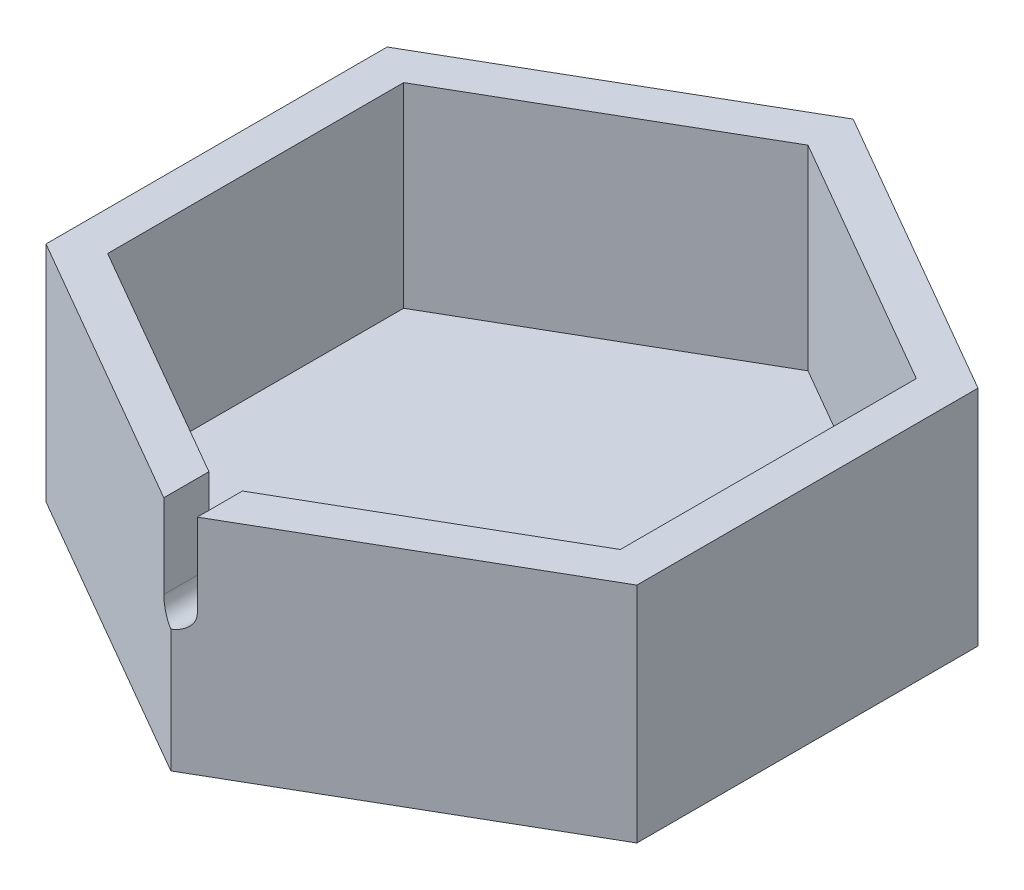
ISO-10303-21;
HEADER;
FILE_DESCRIPTION(('STEP AP214'),'2;1');
FILE_NAME('part.step','',(''),(''),'','','');
FILE_SCHEMA(('AUTOMOTIVE_DESIGN { 1 0 10303 214 1 1 1 1 }'));
ENDSEC;
DATA;
#1=APPLICATION_CONTEXT('core data for automotive mechanical design processes');
#2=APPLICATION_PROTOCOL_DEFINITION('international standard','automotive_design',2000,#1);
#3=PRODUCT_CONTEXT('',#1,'mechanical');
#4=PRODUCT('Part','Part','',(#3));
#5=PRODUCT_RELATED_PRODUCT_CATEGORY('part','',(#4));
#6=PRODUCT_DEFINITION_FORMATION('','',#4);
#7=PRODUCT_DEFINITION_CONTEXT('part definition',#1,'design');
#8=PRODUCT_DEFINITION('design','',#6,#7);
#9=PRODUCT_DEFINITION_SHAPE('','',#8);
#10=(LENGTH_UNIT() NAMED_UNIT(*) SI_UNIT(.MILLI.,.METRE.));
#11=(NAMED_UNIT(*) PLANE_ANGLE_UNIT() SI_UNIT($,.RADIAN.));
#12=(NAMED_UNIT(*) SI_UNIT($,.STERADIAN.) SOLID_ANGLE_UNIT());
#13=UNCERTAINTY_MEASURE_WITH_UNIT(LENGTH_MEASURE(1.E-05),#10,'distance_accuracy_value','');
#14=(GEOMETRIC_REPRESENTATION_CONTEXT(3) GLOBAL_UNCERTAINTY_ASSIGNED_CONTEXT((#13)) GLOBAL_UNIT_ASSIGNED_CONTEXT((#10,
#11,#12)) REPRESENTATION_CONTEXT('',''));
#15=CARTESIAN_POINT('',(0.,0.,0.));
#16=DIRECTION('',(0.,0.,1.));
#17=DIRECTION('',(1.,0.,0.));
#18=AXIS2_PLACEMENT_3D('',#15,#16,#17);
#19=CARTESIAN_POINT('',(0.,40.,53.0066462313452));
#20=DIRECTION('',(-0.5,0.,-0.866025403784439));
#21=DIRECTION('',(-0.866025403784439,0.,0.5));
#22=AXIS2_PLACEMENT_3D('',#19,#20,#21);
#23=PLANE('',#22);
#24=DIRECTION('',(0.,-1.,0.));
#25=VECTOR('',#24,1.);
#26=CARTESIAN_POINT('',(3.00000000000005,40.,51.2745954237763));
#27=LINE('',#26,#25);
#28=CARTESIAN_POINT('',(3.00000000000005,40.,51.2745954237763));
#29=VERTEX_POINT('',#28);
#30=CARTESIAN_POINT('',(3.00000000000005,25.,51.2745954237763));
#31=VERTEX_POINT('',#30);
#32=EDGE_CURVE('E159',#29,#31,#27,.T.);
#33=ORIENTED_EDGE('',*,*,#32,.F.);
#34=DIRECTION('',(0.866025403784439,0.,-0.5));
#35=VECTOR('',#34,1.);
#36=CARTESIAN_POINT('',(0.,40.,53.0066462313452));
#37=LINE('',#36,#35);
#38=CARTESIAN_POINT('',(45.9051022057597,40.,26.5033231156726));
#39=VERTEX_POINT('',#38);
#40=EDGE_CURVE('E171',#29,#39,#37,.T.);
#41=ORIENTED_EDGE('',*,*,#40,.T.);
#42=DIRECTION('',(0.,-1.,0.));
#43=VECTOR('',#42,1.);
#44=CARTESIAN_POINT('',(45.9051022057597,40.,26.5033231156726));
#45=LINE('',#44,#43);
#46=CARTESIAN_POINT('',(45.9051022057597,5.,26.5033231156726));
#47=VERTEX_POINT('',#46);
#48=EDGE_CURVE('E225',#39,#47,#45,.T.);
#49=ORIENTED_EDGE('',*,*,#48,.T.);
#50=DIRECTION('',(-0.866025403784439,0.,0.5));
#51=VECTOR('',#50,1.);
#52=CARTESIAN_POINT('',(0.,5.,53.0066462313452));
#53=LINE('',#52,#51);
#54=CARTESIAN_POINT('',(0.,5.,53.0066462313452));
#55=VERTEX_POINT('',#54);
#56=EDGE_CURVE('E182',#47,#55,#53,.T.);
#57=ORIENTED_EDGE('',*,*,#56,.T.);
#58=DIRECTION('',(0.,-1.,0.));
#59=VECTOR('',#58,1.);
#60=CARTESIAN_POINT('',(0.,40.,53.0066462313452));
#61=LINE('',#60,#59);
#62=CARTESIAN_POINT('',(0.,22.,53.0066462313452));
#63=VERTEX_POINT('',#62);
#64=EDGE_CURVE('E206',#63,#55,#61,.T.);
#65=ORIENTED_EDGE('',*,*,#64,.F.);
#66=CARTESIAN_POINT('',(0.,25.,53.0066462313452));
#67=DIRECTION('',(-0.5,0.,-0.866025403784439));
#68=DIRECTION('',(-0.866025403784439,0.,0.5));
#69=AXIS2_PLACEMENT_3D('',#66,#67,#68);
#70=ELLIPSE('',#69,3.46410161513775,3.);
#71=EDGE_CURVE('E174',#31,#63,#70,.T.);
#72=ORIENTED_EDGE('',*,*,#71,.F.);
#73=EDGE_LOOP('',(#33,#41,#49,#57,#65,#72));
#74=FACE_BOUND('',#73,.T.);
#75=ADVANCED_FACE('F41',(#74),#23,.T.);
#76=CARTESIAN_POINT('',(45.9051022057597,40.,26.5033231156726));
#77=DIRECTION('',(-1.,0.,0.));
#78=DIRECTION('',(0.,0.,1.));
#79=AXIS2_PLACEMENT_3D('',#76,#77,#78);
#80=PLANE('',#79);
#81=DIRECTION('',(0.,-1.,0.));
#82=VECTOR('',#81,1.);
#83=CARTESIAN_POINT('',(45.9051022057596,40.,-26.5033231156726));
#84=LINE('',#83,#82);
#85=CARTESIAN_POINT('',(45.9051022057596,40.,-26.5033231156726));
#86=VERTEX_POINT('',#85);
#87=CARTESIAN_POINT('',(45.9051022057596,5.,-26.5033231156726));
#88=VERTEX_POINT('',#87);
#89=EDGE_CURVE('E221',#86,#88,#84,.T.);
#90=ORIENTED_EDGE('',*,*,#89,.T.);
#91=DIRECTION('',(0.,0.,1.));
#92=VECTOR('',#91,1.);
#93=CARTESIAN_POINT('',(45.9051022057597,5.,26.5033231156726));
#94=LINE('',#93,#92);
#95=EDGE_CURVE('E189',#88,#47,#94,.T.);
#96=ORIENTED_EDGE('',*,*,#95,.T.);
#97=ORIENTED_EDGE('',*,*,#48,.F.);
#98=DIRECTION('',(0.,0.,-1.));
#99=VECTOR('',#98,1.);
#100=CARTESIAN_POINT('',(45.9051022057597,40.,26.5033231156726));
#101=LINE('',#100,#99);
#102=EDGE_CURVE('E180',#39,#86,#101,.T.);
#103=ORIENTED_EDGE('',*,*,#102,.T.);
#104=EDGE_LOOP('',(#90,#96,#97,#103));
#105=FACE_BOUND('',#104,.T.);
#106=ADVANCED_FACE('F332',(#105),#80,.T.);
#107=CARTESIAN_POINT('',(45.9051022057596,40.,-26.5033231156726));
#108=DIRECTION('',(-0.5,0.,0.866025403784439));
#109=DIRECTION('',(0.866025403784439,0.,0.5));
#110=AXIS2_PLACEMENT_3D('',#107,#108,#109);
#111=PLANE('',#110);
#112=DIRECTION('',(0.,-1.,0.));
#113=VECTOR('',#112,1.);
#114=CARTESIAN_POINT('',(0.,40.,-53.0066462313452));
#115=LINE('',#114,#113);
#116=CARTESIAN_POINT('',(0.,40.,-53.0066462313452));
#117=VERTEX_POINT('',#116);
#118=CARTESIAN_POINT('',(0.,5.,-53.0066462313452));
#119=VERTEX_POINT('',#118);
#120=EDGE_CURVE('E217',#117,#119,#115,.T.);
#121=ORIENTED_EDGE('',*,*,#120,.T.);
#122=DIRECTION('',(0.866025403784439,0.,0.5));
#123=VECTOR('',#122,1.);
#124=CARTESIAN_POINT('',(45.9051022057596,5.,-26.5033231156726));
#125=LINE('',#124,#123);
#126=EDGE_CURVE('E326',#119,#88,#125,.T.);
#127=ORIENTED_EDGE('',*,*,#126,.T.);
#128=ORIENTED_EDGE('',*,*,#89,.F.);
#129=DIRECTION('',(-0.866025403784439,0.,-0.5));
#130=VECTOR('',#129,1.);
#131=CARTESIAN_POINT('',(45.9051022057596,40.,-26.5033231156726));
#132=LINE('',#131,#130);
#133=EDGE_CURVE('E186',#86,#117,#132,.T.);
#134=ORIENTED_EDGE('',*,*,#133,.T.);
#135=EDGE_LOOP('',(#121,#127,#128,#134));
#136=FACE_BOUND('',#135,.T.);
#137=ADVANCED_FACE('F363',(#136),#111,.T.);
#138=CARTESIAN_POINT('',(0.,40.,-53.0066462313452));
#139=DIRECTION('',(0.5,0.,0.866025403784439));
#140=DIRECTION('',(0.866025403784439,0.,-0.5));
#141=AXIS2_PLACEMENT_3D('',#138,#139,#140);
#142=PLANE('',#141);
#143=DIRECTION('',(0.,-1.,0.));
#144=VECTOR('',#143,1.);
#145=CARTESIAN_POINT('',(-45.9051022057596,40.,-26.5033231156726));
#146=LINE('',#145,#144);
#147=CARTESIAN_POINT('',(-45.9051022057596,40.,-26.5033231156726));
#148=VERTEX_POINT('',#147);
#149=CARTESIAN_POINT('',(-45.9051022057596,5.,-26.5033231156726));
#150=VERTEX_POINT('',#149);
#151=EDGE_CURVE('E213',#148,#150,#146,.T.);
#152=ORIENTED_EDGE('',*,*,#151,.T.);
#153=DIRECTION('',(0.866025403784439,0.,-0.5));
#154=VECTOR('',#153,1.);
#155=CARTESIAN_POINT('',(0.,5.,-53.0066462313452));
#156=LINE('',#155,#154);
#157=EDGE_CURVE('E322',#150,#119,#156,.T.);
#158=ORIENTED_EDGE('',*,*,#157,.T.);
#159=ORIENTED_EDGE('',*,*,#120,.F.);
#160=DIRECTION('',(-0.866025403784439,0.,0.5));
#161=VECTOR('',#160,1.);
#162=CARTESIAN_POINT('',(0.,40.,-53.0066462313452));
#163=LINE('',#162,#161);
#164=EDGE_CURVE('E195',#117,#148,#163,.T.);
#165=ORIENTED_EDGE('',*,*,#164,.T.);
#166=EDGE_LOOP('',(#152,#158,#159,#165));
#167=FACE_BOUND('',#166,.T.);
#168=ADVANCED_FACE('F430',(#167),#142,.T.);
#169=CARTESIAN_POINT('',(-45.9051022057596,40.,-26.5033231156726));
#170=DIRECTION('',(1.,0.,0.));
#171=DIRECTION('',(0.,0.,-1.));
#172=AXIS2_PLACEMENT_3D('',#169,#170,#171);
#173=PLANE('',#172);
#174=DIRECTION('',(0.,-1.,0.));
#175=VECTOR('',#174,1.);
#176=CARTESIAN_POINT('',(-45.9051022057596,40.,26.5033231156726));
#177=LINE('',#176,#175);
#178=CARTESIAN_POINT('',(-45.9051022057596,40.,26.5033231156726));
#179=VERTEX_POINT('',#178);
#180=CARTESIAN_POINT('',(-45.9051022057596,5.,26.5033231156726));
#181=VERTEX_POINT('',#180);
#182=EDGE_CURVE('E209',#179,#181,#177,.T.);
#183=ORIENTED_EDGE('',*,*,#182,.T.);
#184=DIRECTION('',(0.,0.,-1.));
#185=VECTOR('',#184,1.);
#186=CARTESIAN_POINT('',(-45.9051022057596,5.,-26.5033231156726));
#187=LINE('',#186,#185);
#188=EDGE_CURVE('E65',#181,#150,#187,.T.);
#189=ORIENTED_EDGE('',*,*,#188,.T.);
#190=ORIENTED_EDGE('',*,*,#151,.F.);
#191=DIRECTION('',(0.,0.,1.));
#192=VECTOR('',#191,1.);
#193=CARTESIAN_POINT('',(-45.9051022057596,40.,-26.5033231156726));
#194=LINE('',#193,#192);
#195=EDGE_CURVE('E198',#148,#179,#194,.T.);
#196=ORIENTED_EDGE('',*,*,#195,.T.);
#197=EDGE_LOOP('',(#183,#189,#190,#196));
#198=FACE_BOUND('',#197,.T.);
#199=ADVANCED_FACE('F339',(#198),#173,.T.);
#200=CARTESIAN_POINT('',(-45.9051022057596,40.,26.5033231156726));
#201=DIRECTION('',(0.5,0.,-0.866025403784439));
#202=DIRECTION('',(-0.866025403784439,0.,-0.5));
#203=AXIS2_PLACEMENT_3D('',#200,#201,#202);
#204=PLANE('',#203);
#205=CARTESIAN_POINT('',(0.,25.,53.0066462313453));
#206=DIRECTION('',(0.5,0.,-0.866025403784439));
#207=DIRECTION('',(0.866025403784439,0.,0.5));
#208=AXIS2_PLACEMENT_3D('',#205,#206,#207);
#209=ELLIPSE('',#208,3.46410161513775,3.);
#210=CARTESIAN_POINT('',(-2.99999999999995,25.,51.2745954237764));
#211=VERTEX_POINT('',#210);
#212=EDGE_CURVE('E310',#63,#211,#209,.T.);
#213=ORIENTED_EDGE('',*,*,#212,.F.);
#214=ORIENTED_EDGE('',*,*,#64,.T.);
#215=DIRECTION('',(-0.866025403784439,0.,-0.5));
#216=VECTOR('',#215,1.);
#217=CARTESIAN_POINT('',(-45.9051022057596,5.,26.5033231156726));
#218=LINE('',#217,#216);
#219=EDGE_CURVE('E290',#55,#181,#218,.T.);
#220=ORIENTED_EDGE('',*,*,#219,.T.);
#221=ORIENTED_EDGE('',*,*,#182,.F.);
#222=DIRECTION('',(0.866025403784439,0.,0.5));
#223=VECTOR('',#222,1.);
#224=CARTESIAN_POINT('',(-45.9051022057596,40.,26.5033231156726));
#225=LINE('',#224,#223);
#226=CARTESIAN_POINT('',(-2.99999999999995,40.,51.2745954237764));
#227=VERTEX_POINT('',#226);
#228=EDGE_CURVE('E202',#179,#227,#225,.T.);
#229=ORIENTED_EDGE('',*,*,#228,.T.);
#230=DIRECTION('',(0.,1.,0.));
#231=VECTOR('',#230,1.);
#232=CARTESIAN_POINT('',(-2.99999999999995,40.,51.2745954237764));
#233=LINE('',#232,#231);
#234=EDGE_CURVE('E165',#211,#227,#233,.T.);
#235=ORIENTED_EDGE('',*,*,#234,.F.);
#236=EDGE_LOOP('',(#213,#214,#220,#221,#229,#235));
#237=FACE_BOUND('',#236,.T.);
#238=ADVANCED_FACE('F337',(#237),#204,.T.);
#239=CARTESIAN_POINT('',(0.,40.,0.));
#240=DIRECTION('',(0.,1.,0.));
#241=DIRECTION('',(0.,0.,1.));
#242=AXIS2_PLACEMENT_3D('',#239,#240,#241);
#243=PLANE('',#242);
#244=DIRECTION('',(0.,0.,1.));
#245=VECTOR('',#244,1.);
#246=CARTESIAN_POINT('',(3.00000000000005,40.,41.5));
#247=LINE('',#246,#245);
#248=CARTESIAN_POINT('',(3.00000000000005,40.,59.3574991924311));
#249=VERTEX_POINT('',#248);
#250=EDGE_CURVE('E155',#29,#249,#247,.T.);
#251=ORIENTED_EDGE('',*,*,#250,.T.);
#252=DIRECTION('',(0.866025403784438,0.,-0.5));
#253=VECTOR('',#252,1.);
#254=CARTESIAN_POINT('',(0.,40.,61.08955));
#255=LINE('',#254,#253);
#256=CARTESIAN_POINT('',(52.9051022057597,40.,30.544775));
#257=VERTEX_POINT('',#256);
#258=EDGE_CURVE('E229',#249,#257,#255,.T.);
#259=ORIENTED_EDGE('',*,*,#258,.T.);
#260=DIRECTION('',(0.,0.,-1.));
#261=VECTOR('',#260,1.);
#262=CARTESIAN_POINT('',(52.9051022057597,40.,30.544775));
#263=LINE('',#262,#261);
#264=CARTESIAN_POINT('',(52.9051022057597,40.,-30.544775));
#265=VERTEX_POINT('',#264);
#266=EDGE_CURVE('E232',#257,#265,#263,.T.);
#267=ORIENTED_EDGE('',*,*,#266,.T.);
#268=DIRECTION('',(-0.866025403784439,0.,-0.5));
#269=VECTOR('',#268,1.);
#270=CARTESIAN_POINT('',(52.9051022057597,40.,-30.544775));
#271=LINE('',#270,#269);
#272=CARTESIAN_POINT('',(0.,40.,-61.08955));
#273=VERTEX_POINT('',#272);
#274=EDGE_CURVE('E236',#265,#273,#271,.T.);
#275=ORIENTED_EDGE('',*,*,#274,.T.);
#276=DIRECTION('',(-0.866025403784438,0.,0.5));
#277=VECTOR('',#276,1.);
#278=CARTESIAN_POINT('',(0.,40.,-61.08955));
#279=LINE('',#278,#277);
#280=CARTESIAN_POINT('',(-52.9051022057596,40.,-30.544775));
#281=VERTEX_POINT('',#280);
#282=EDGE_CURVE('E239',#273,#281,#279,.T.);
#283=ORIENTED_EDGE('',*,*,#282,.T.);
#284=DIRECTION('',(0.,0.,1.));
#285=VECTOR('',#284,1.);
#286=CARTESIAN_POINT('',(-52.9051022057596,40.,-30.544775));
#287=LINE('',#286,#285);
#288=CARTESIAN_POINT('',(-52.9051022057596,40.,30.544775));
#289=VERTEX_POINT('',#288);
#290=EDGE_CURVE('E242',#281,#289,#287,.T.);
#291=ORIENTED_EDGE('',*,*,#290,.T.);
#292=DIRECTION('',(0.866025403784439,0.,0.5));
#293=VECTOR('',#292,1.);
#294=CARTESIAN_POINT('',(-52.9051022057596,40.,30.544775));
#295=LINE('',#294,#293);
#296=CARTESIAN_POINT('',(-2.99999999999995,40.,59.3574991924311));
#297=VERTEX_POINT('',#296);
#298=EDGE_CURVE('E245',#289,#297,#295,.T.);
#299=ORIENTED_EDGE('',*,*,#298,.T.);
#300=DIRECTION('',(0.,0.,1.));
#301=VECTOR('',#300,1.);
#302=CARTESIAN_POINT('',(-2.99999999999995,40.,41.5));
#303=LINE('',#302,#301);
#304=EDGE_CURVE('E57',#227,#297,#303,.T.);
#305=ORIENTED_EDGE('',*,*,#304,.F.);
#306=ORIENTED_EDGE('',*,*,#228,.F.);
#307=ORIENTED_EDGE('',*,*,#195,.F.);
#308=ORIENTED_EDGE('',*,*,#164,.F.);
#309=ORIENTED_EDGE('',*,*,#133,.F.);
#310=ORIENTED_EDGE('',*,*,#102,.F.);
#311=ORIENTED_EDGE('',*,*,#40,.F.);
#312=EDGE_LOOP('',(#251,#259,#267,#275,#283,#291,#299,#305,#306,#307,#308,#309,#310,#311));
#313=FACE_BOUND('',#312,.T.);
#314=ADVANCED_FACE('F178',(#313),#243,.T.);
#315=CARTESIAN_POINT('',(0.,0.,0.));
#316=DIRECTION('',(0.,1.,0.));
#317=DIRECTION('',(0.,0.,1.));
#318=AXIS2_PLACEMENT_3D('',#315,#316,#317);
#319=PLANE('',#318);
#320=DIRECTION('',(0.866025403784438,0.,-0.5));
#321=VECTOR('',#320,1.);
#322=CARTESIAN_POINT('',(0.,0.,61.08955));
#323=LINE('',#322,#321);
#324=CARTESIAN_POINT('',(0.,0.,61.08955));
#325=VERTEX_POINT('',#324);
#326=CARTESIAN_POINT('',(52.9051022057597,0.,30.544775));
#327=VERTEX_POINT('',#326);
#328=EDGE_CURVE('E228',#325,#327,#323,.T.);
#329=ORIENTED_EDGE('',*,*,#328,.F.);
#330=DIRECTION('',(0.866025403784439,0.,0.5));
#331=VECTOR('',#330,1.);
#332=CARTESIAN_POINT('',(-52.9051022057596,0.,30.544775));
#333=LINE('',#332,#331);
#334=CARTESIAN_POINT('',(-52.9051022057596,0.,30.544775));
#335=VERTEX_POINT('',#334);
#336=EDGE_CURVE('E233',#335,#325,#333,.T.);
#337=ORIENTED_EDGE('',*,*,#336,.F.);
#338=DIRECTION('',(0.,0.,1.));
#339=VECTOR('',#338,1.);
#340=CARTESIAN_POINT('',(-52.9051022057596,0.,-30.544775));
#341=LINE('',#340,#339);
#342=CARTESIAN_POINT('',(-52.9051022057596,0.,-30.544775));
#343=VERTEX_POINT('',#342);
#344=EDGE_CURVE('E262',#343,#335,#341,.T.);
#345=ORIENTED_EDGE('',*,*,#344,.F.);
#346=DIRECTION('',(-0.866025403784438,0.,0.5));
#347=VECTOR('',#346,1.);
#348=CARTESIAN_POINT('',(0.,0.,-61.08955));
#349=LINE('',#348,#347);
#350=CARTESIAN_POINT('',(0.,0.,-61.08955));
#351=VERTEX_POINT('',#350);
#352=EDGE_CURVE('E259',#351,#343,#349,.T.);
#353=ORIENTED_EDGE('',*,*,#352,.F.);
#354=DIRECTION('',(-0.866025403784439,0.,-0.5));
#355=VECTOR('',#354,1.);
#356=CARTESIAN_POINT('',(52.9051022057597,0.,-30.544775));
#357=LINE('',#356,#355);
#358=CARTESIAN_POINT('',(52.9051022057597,0.,-30.544775));
#359=VERTEX_POINT('',#358);
#360=EDGE_CURVE('E256',#359,#351,#357,.T.);
#361=ORIENTED_EDGE('',*,*,#360,.F.);
#362=DIRECTION('',(0.,0.,-1.));
#363=VECTOR('',#362,1.);
#364=CARTESIAN_POINT('',(52.9051022057597,0.,30.544775));
#365=LINE('',#364,#363);
#366=EDGE_CURVE('E253',#327,#359,#365,.T.);
#367=ORIENTED_EDGE('',*,*,#366,.F.);
#368=EDGE_LOOP('',(#329,#337,#345,#353,#361,#367));
#369=FACE_BOUND('',#368,.T.);
#370=ADVANCED_FACE('F369',(#369),#319,.F.);
#371=CARTESIAN_POINT('',(0.,40.,61.08955));
#372=DIRECTION('',(-0.5,0.,-0.866025403784438));
#373=DIRECTION('',(-0.866025403784439,0.,0.5));
#374=AXIS2_PLACEMENT_3D('',#371,#372,#373);
#375=PLANE('',#374);
#376=ORIENTED_EDGE('',*,*,#258,.F.);
#377=DIRECTION('',(0.,-1.,0.));
#378=VECTOR('',#377,1.);
#379=CARTESIAN_POINT('',(3.00000000000005,40.,59.3574991924311));
#380=LINE('',#379,#378);
#381=CARTESIAN_POINT('',(3.00000000000005,25.,59.3574991924311));
#382=VERTEX_POINT('',#381);
#383=EDGE_CURVE('E11',#249,#382,#380,.T.);
#384=ORIENTED_EDGE('',*,*,#383,.T.);
#385=CARTESIAN_POINT('',(0.,25.,61.08955));
#386=DIRECTION('',(-0.5,0.,-0.866025403784438));
#387=DIRECTION('',(-0.866025403784439,0.,0.5));
#388=AXIS2_PLACEMENT_3D('',#385,#386,#387);
#389=ELLIPSE('',#388,3.46410161513776,3.);
#390=CARTESIAN_POINT('',(0.,22.,61.08955));
#391=VERTEX_POINT('',#390);
#392=EDGE_CURVE('E305',#382,#391,#389,.T.);
#393=ORIENTED_EDGE('',*,*,#392,.T.);
#394=DIRECTION('',(0.,-1.,0.));
#395=VECTOR('',#394,1.);
#396=CARTESIAN_POINT('',(0.,40.,61.08955));
#397=LINE('',#396,#395);
#398=EDGE_CURVE('E249',#391,#325,#397,.T.);
#399=ORIENTED_EDGE('',*,*,#398,.T.);
#400=ORIENTED_EDGE('',*,*,#328,.T.);
#401=DIRECTION('',(0.,-1.,0.));
#402=VECTOR('',#401,1.);
#403=CARTESIAN_POINT('',(52.9051022057597,40.,30.544775));
#404=LINE('',#403,#402);
#405=EDGE_CURVE('E286',#257,#327,#404,.T.);
#406=ORIENTED_EDGE('',*,*,#405,.F.);
#407=EDGE_LOOP('',(#376,#384,#393,#399,#400,#406));
#408=FACE_BOUND('',#407,.T.);
#409=ADVANCED_FACE('F43',(#408),#375,.F.);
#410=CARTESIAN_POINT('',(52.9051022057597,40.,30.544775));
#411=DIRECTION('',(-1.,0.,0.));
#412=DIRECTION('',(0.,0.,1.));
#413=AXIS2_PLACEMENT_3D('',#410,#411,#412);
#414=PLANE('',#413);
#415=ORIENTED_EDGE('',*,*,#366,.T.);
#416=DIRECTION('',(0.,-1.,0.));
#417=VECTOR('',#416,1.);
#418=CARTESIAN_POINT('',(52.9051022057597,40.,-30.544775));
#419=LINE('',#418,#417);
#420=EDGE_CURVE('E282',#265,#359,#419,.T.);
#421=ORIENTED_EDGE('',*,*,#420,.F.);
#422=ORIENTED_EDGE('',*,*,#266,.F.);
#423=ORIENTED_EDGE('',*,*,#405,.T.);
#424=EDGE_LOOP('',(#415,#421,#422,#423));
#425=FACE_BOUND('',#424,.T.);
#426=ADVANCED_FACE('F385',(#425),#414,.F.);
#427=CARTESIAN_POINT('',(52.9051022057597,40.,-30.544775));
#428=DIRECTION('',(-0.5,0.,0.866025403784439));
#429=DIRECTION('',(0.866025403784439,0.,0.5));
#430=AXIS2_PLACEMENT_3D('',#427,#428,#429);
#431=PLANE('',#430);
#432=ORIENTED_EDGE('',*,*,#360,.T.);
#433=DIRECTION('',(0.,-1.,0.));
#434=VECTOR('',#433,1.);
#435=CARTESIAN_POINT('',(0.,40.,-61.08955));
#436=LINE('',#435,#434);
#437=EDGE_CURVE('E278',#273,#351,#436,.T.);
#438=ORIENTED_EDGE('',*,*,#437,.F.);
#439=ORIENTED_EDGE('',*,*,#274,.F.);
#440=ORIENTED_EDGE('',*,*,#420,.T.);
#441=EDGE_LOOP('',(#432,#438,#439,#440));
#442=FACE_BOUND('',#441,.T.);
#443=ADVANCED_FACE('F382',(#442),#431,.F.);
#444=CARTESIAN_POINT('',(0.,40.,-61.08955));
#445=DIRECTION('',(0.5,0.,0.866025403784439));
#446=DIRECTION('',(0.866025403784439,0.,-0.5));
#447=AXIS2_PLACEMENT_3D('',#444,#445,#446);
#448=PLANE('',#447);
#449=ORIENTED_EDGE('',*,*,#352,.T.);
#450=DIRECTION('',(0.,-1.,0.));
#451=VECTOR('',#450,1.);
#452=CARTESIAN_POINT('',(-52.9051022057596,40.,-30.544775));
#453=LINE('',#452,#451);
#454=EDGE_CURVE('E274',#281,#343,#453,.T.);
#455=ORIENTED_EDGE('',*,*,#454,.F.);
#456=ORIENTED_EDGE('',*,*,#282,.F.);
#457=ORIENTED_EDGE('',*,*,#437,.T.);
#458=EDGE_LOOP('',(#449,#455,#456,#457));
#459=FACE_BOUND('',#458,.T.);
#460=ADVANCED_FACE('F378',(#459),#448,.F.);
#461=CARTESIAN_POINT('',(-52.9051022057596,40.,-30.544775));
#462=DIRECTION('',(1.,0.,0.));
#463=DIRECTION('',(0.,0.,-1.));
#464=AXIS2_PLACEMENT_3D('',#461,#462,#463);
#465=PLANE('',#464);
#466=ORIENTED_EDGE('',*,*,#344,.T.);
#467=DIRECTION('',(0.,-1.,0.));
#468=VECTOR('',#467,1.);
#469=CARTESIAN_POINT('',(-52.9051022057596,40.,30.544775));
#470=LINE('',#469,#468);
#471=EDGE_CURVE('E270',#289,#335,#470,.T.);
#472=ORIENTED_EDGE('',*,*,#471,.F.);
#473=ORIENTED_EDGE('',*,*,#290,.F.);
#474=ORIENTED_EDGE('',*,*,#454,.T.);
#475=EDGE_LOOP('',(#466,#472,#473,#474));
#476=FACE_BOUND('',#475,.T.);
#477=ADVANCED_FACE('F375',(#476),#465,.F.);
#478=CARTESIAN_POINT('',(-52.9051022057596,40.,30.544775));
#479=DIRECTION('',(0.5,0.,-0.866025403784439));
#480=DIRECTION('',(-0.866025403784439,0.,-0.5));
#481=AXIS2_PLACEMENT_3D('',#478,#479,#480);
#482=PLANE('',#481);
#483=ORIENTED_EDGE('',*,*,#398,.F.);
#484=CARTESIAN_POINT('',(0.,25.,61.08955));
#485=DIRECTION('',(0.5,0.,-0.866025403784439));
#486=DIRECTION('',(0.866025403784439,0.,0.5));
#487=AXIS2_PLACEMENT_3D('',#484,#485,#486);
#488=ELLIPSE('',#487,3.46410161513775,3.);
#489=CARTESIAN_POINT('',(-2.99999999999995,25.,59.3574991924311));
#490=VERTEX_POINT('',#489);
#491=EDGE_CURVE('E50',#391,#490,#488,.T.);
#492=ORIENTED_EDGE('',*,*,#491,.T.);
#493=DIRECTION('',(0.,1.,0.));
#494=VECTOR('',#493,1.);
#495=CARTESIAN_POINT('',(-2.99999999999995,40.,59.3574991924311));
#496=LINE('',#495,#494);
#497=EDGE_CURVE('E293',#490,#297,#496,.T.);
#498=ORIENTED_EDGE('',*,*,#497,.T.);
#499=ORIENTED_EDGE('',*,*,#298,.F.);
#500=ORIENTED_EDGE('',*,*,#471,.T.);
#501=ORIENTED_EDGE('',*,*,#336,.T.);
#502=EDGE_LOOP('',(#483,#492,#498,#499,#500,#501));
#503=FACE_BOUND('',#502,.T.);
#504=ADVANCED_FACE('F299',(#503),#482,.F.);
#505=CARTESIAN_POINT('',(0.,5.,0.));
#506=DIRECTION('',(0.,-1.,0.));
#507=DIRECTION('',(0.,0.,-1.));
#508=AXIS2_PLACEMENT_3D('',#505,#506,#507);
#509=PLANE('',#508);
#510=ORIENTED_EDGE('',*,*,#56,.F.);
#511=ORIENTED_EDGE('',*,*,#95,.F.);
#512=ORIENTED_EDGE('',*,*,#126,.F.);
#513=ORIENTED_EDGE('',*,*,#157,.F.);
#514=ORIENTED_EDGE('',*,*,#188,.F.);
#515=ORIENTED_EDGE('',*,*,#219,.F.);
#516=EDGE_LOOP('',(#510,#511,#512,#513,#514,#515));
#517=FACE_BOUND('',#516,.T.);
#518=ADVANCED_FACE('F334',(#517),#509,.F.);
#519=CARTESIAN_POINT('',(3.00000000000005,40.,41.5));
#520=DIRECTION('',(1.,0.,0.));
#521=DIRECTION('',(0.,1.,0.));
#522=AXIS2_PLACEMENT_3D('',#519,#520,#521);
#523=PLANE('',#522);
#524=ORIENTED_EDGE('',*,*,#32,.T.);
#525=DIRECTION('',(0.,0.,1.));
#526=VECTOR('',#525,1.);
#527=CARTESIAN_POINT('',(3.00000000000005,25.,41.5));
#528=LINE('',#527,#526);
#529=EDGE_CURVE('E166',#31,#382,#528,.T.);
#530=ORIENTED_EDGE('',*,*,#529,.T.);
#531=ORIENTED_EDGE('',*,*,#383,.F.);
#532=ORIENTED_EDGE('',*,*,#250,.F.);
#533=EDGE_LOOP('',(#524,#530,#531,#532));
#534=FACE_BOUND('',#533,.T.);
#535=ADVANCED_FACE('F157',(#534),#523,.F.);
#536=CARTESIAN_POINT('',(0.,25.,41.5));
#537=DIRECTION('',(0.,0.,1.));
#538=DIRECTION('',(1.,0.,0.));
#539=AXIS2_PLACEMENT_3D('',#536,#537,#538);
#540=CYLINDRICAL_SURFACE('',#539,3.);
#541=ORIENTED_EDGE('',*,*,#71,.T.);
#542=ORIENTED_EDGE('',*,*,#212,.T.);
#543=DIRECTION('',(0.,0.,1.));
#544=VECTOR('',#543,1.);
#545=CARTESIAN_POINT('',(-2.99999999999995,25.,41.5));
#546=LINE('',#545,#544);
#547=EDGE_CURVE('E307',#211,#490,#546,.T.);
#548=ORIENTED_EDGE('',*,*,#547,.T.);
#549=ORIENTED_EDGE('',*,*,#491,.F.);
#550=ORIENTED_EDGE('',*,*,#392,.F.);
#551=ORIENTED_EDGE('',*,*,#529,.F.);
#552=EDGE_LOOP('',(#541,#542,#548,#549,#550,#551));
#553=FACE_BOUND('',#552,.T.);
#554=ADVANCED_FACE('F304',(#553),#540,.F.);
#555=CARTESIAN_POINT('',(-2.99999999999995,40.,41.5));
#556=DIRECTION('',(-1.,0.,0.));
#557=DIRECTION('',(0.,-1.,0.));
#558=AXIS2_PLACEMENT_3D('',#555,#556,#557);
#559=PLANE('',#558);
#560=ORIENTED_EDGE('',*,*,#234,.T.);
#561=ORIENTED_EDGE('',*,*,#304,.T.);
#562=ORIENTED_EDGE('',*,*,#497,.F.);
#563=ORIENTED_EDGE('',*,*,#547,.F.);
#564=EDGE_LOOP('',(#560,#561,#562,#563));
#565=FACE_BOUND('',#564,.T.);
#566=ADVANCED_FACE('F345',(#565),#559,.F.);
#567=CLOSED_SHELL('',(#75,#106,#137,#168,#199,#238,#314,#370,#409,#426,#443,#460,#477,#504,#518,
#535,#554,#566));
#568=MANIFOLD_SOLID_BREP('B2',#567);
#569=ADVANCED_BREP_SHAPE_REPRESENTATION('',(#18,#568),#14);
#570=SHAPE_DEFINITION_REPRESENTATION(#9,#569);
ENDSEC;
END-ISO-10303-21;
